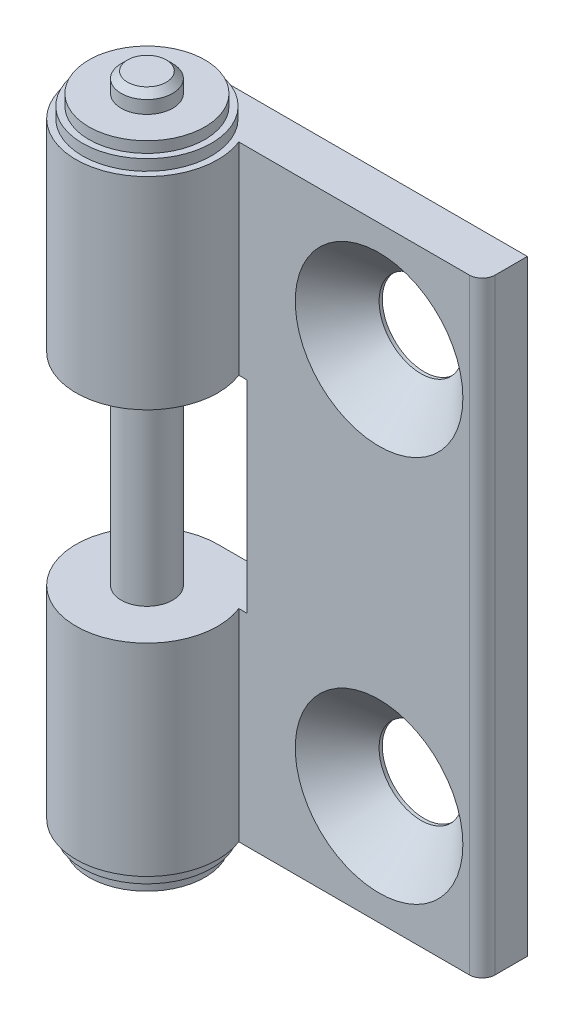
ISO-10303-21;
HEADER;
FILE_DESCRIPTION(('STEP AP214'),'2;1');
FILE_NAME('part.step','',(''),(''),'','','');
FILE_SCHEMA(('AUTOMOTIVE_DESIGN { 1 0 10303 214 1 1 1 1 }'));
ENDSEC;
DATA;
#1=APPLICATION_CONTEXT('core data for automotive mechanical design processes');
#2=APPLICATION_PROTOCOL_DEFINITION('international standard','automotive_design',2000,#1);
#3=PRODUCT_CONTEXT('',#1,'mechanical');
#4=PRODUCT('Part','Part','',(#3));
#5=PRODUCT_RELATED_PRODUCT_CATEGORY('part','',(#4));
#6=PRODUCT_DEFINITION_FORMATION('','',#4);
#7=PRODUCT_DEFINITION_CONTEXT('part definition',#1,'design');
#8=PRODUCT_DEFINITION('design','',#6,#7);
#9=PRODUCT_DEFINITION_SHAPE('','',#8);
#10=(LENGTH_UNIT() NAMED_UNIT(*) SI_UNIT(.MILLI.,.METRE.));
#11=(NAMED_UNIT(*) PLANE_ANGLE_UNIT() SI_UNIT($,.RADIAN.));
#12=(NAMED_UNIT(*) SI_UNIT($,.STERADIAN.) SOLID_ANGLE_UNIT());
#13=UNCERTAINTY_MEASURE_WITH_UNIT(LENGTH_MEASURE(1.E-05),#10,'distance_accuracy_value','');
#14=(GEOMETRIC_REPRESENTATION_CONTEXT(3) GLOBAL_UNCERTAINTY_ASSIGNED_CONTEXT((#13)) GLOBAL_UNIT_ASSIGNED_CONTEXT((#10,
#11,#12)) REPRESENTATION_CONTEXT('',''));
#15=CARTESIAN_POINT('',(0.,0.,0.));
#16=DIRECTION('',(0.,0.,1.));
#17=DIRECTION('',(1.,0.,0.));
#18=AXIS2_PLACEMENT_3D('',#15,#16,#17);
#19=CARTESIAN_POINT('',(1.5,-26.7,0.));
#20=DIRECTION('',(0.,1.,0.));
#21=DIRECTION('',(0.,0.,1.));
#22=AXIS2_PLACEMENT_3D('',#19,#20,#21);
#23=PLANE('',#22);
#24=CARTESIAN_POINT('',(0.,-26.6999999999484,0.));
#25=DIRECTION('',(0.,1.,0.));
#26=DIRECTION('',(0.,0.,1.));
#27=AXIS2_PLACEMENT_3D('',#24,#25,#26);
#28=CIRCLE('',#27,1.50000000007822);
#29=CARTESIAN_POINT('',(0.,-26.6999999999484,1.50000000007822));
#30=VERTEX_POINT('',#29);
#31=EDGE_CURVE('P0_E17',#30,#30,#28,.T.);
#32=ORIENTED_EDGE('',*,*,#31,.F.);
#33=EDGE_LOOP('',(#32));
#34=FACE_BOUND('',#33,.T.);
#35=ADVANCED_FACE('P0_F14',(#34),#23,.F.);
#36=CARTESIAN_POINT('',(0.,26.7,0.));
#37=DIRECTION('',(0.,-1.,0.));
#38=DIRECTION('',(0.,0.,-1.));
#39=AXIS2_PLACEMENT_3D('',#36,#37,#38);
#40=PLANE('',#39);
#41=CARTESIAN_POINT('',(0.,26.7000000000621,0.));
#42=DIRECTION('',(0.,-1.,0.));
#43=DIRECTION('',(0.,0.,-1.));
#44=AXIS2_PLACEMENT_3D('',#41,#42,#43);
#45=CIRCLE('',#44,1.50000000002137);
#46=CARTESIAN_POINT('',(0.,26.7000000000621,-1.50000000002137));
#47=VERTEX_POINT('',#46);
#48=EDGE_CURVE('P0_E26',#47,#47,#45,.T.);
#49=ORIENTED_EDGE('',*,*,#48,.F.);
#50=EDGE_LOOP('',(#49));
#51=FACE_BOUND('',#50,.T.);
#52=ADVANCED_FACE('P0_F41',(#51),#40,.F.);
#53=CARTESIAN_POINT('',(0.,-26.2000000001308,0.));
#54=DIRECTION('',(0.,1.,0.));
#55=DIRECTION('',(0.,0.,1.));
#56=AXIS2_PLACEMENT_3D('',#53,#54,#55);
#57=CONICAL_SURFACE('',#56,1.99999999989586,0.785398163397448);
#58=CARTESIAN_POINT('',(0.,-26.2,0.));
#59=DIRECTION('',(0.,1.,0.));
#60=DIRECTION('',(0.,0.,1.));
#61=AXIS2_PLACEMENT_3D('',#58,#59,#60);
#62=CIRCLE('',#61,2.);
#63=CARTESIAN_POINT('',(0.,-26.2,2.));
#64=VERTEX_POINT('',#63);
#65=EDGE_CURVE('P0_E21',#64,#64,#62,.T.);
#66=ORIENTED_EDGE('',*,*,#65,.F.);
#67=EDGE_LOOP('',(#66));
#68=FACE_BOUND('',#67,.T.);
#69=ORIENTED_EDGE('',*,*,#31,.T.);
#70=EDGE_LOOP('',(#69));
#71=FACE_BOUND('',#70,.T.);
#72=ADVANCED_FACE('P0_F38',(#68,#71),#57,.T.);
#73=CARTESIAN_POINT('',(0.,26.2000000001308,0.));
#74=DIRECTION('',(0.,-1.,0.));
#75=DIRECTION('',(0.,0.,-1.));
#76=AXIS2_PLACEMENT_3D('',#73,#74,#75);
#77=CONICAL_SURFACE('',#76,1.99999999995271,0.785398163397448);
#78=ORIENTED_EDGE('',*,*,#48,.T.);
#79=EDGE_LOOP('',(#78));
#80=FACE_BOUND('',#79,.T.);
#81=CARTESIAN_POINT('',(0.,26.2,0.));
#82=DIRECTION('',(0.,1.,0.));
#83=DIRECTION('',(0.,0.,1.));
#84=AXIS2_PLACEMENT_3D('',#81,#82,#83);
#85=CIRCLE('',#84,2.);
#86=CARTESIAN_POINT('',(0.,26.2,2.));
#87=VERTEX_POINT('',#86);
#88=EDGE_CURVE('P0_E10',#87,#87,#85,.F.);
#89=ORIENTED_EDGE('',*,*,#88,.F.);
#90=EDGE_LOOP('',(#89));
#91=FACE_BOUND('',#90,.T.);
#92=ADVANCED_FACE('P0_F49',(#80,#91),#77,.T.);
#93=CARTESIAN_POINT('',(0.,-26.7,0.));
#94=DIRECTION('',(0.,1.,0.));
#95=DIRECTION('',(0.,0.,1.));
#96=AXIS2_PLACEMENT_3D('',#93,#94,#95);
#97=CYLINDRICAL_SURFACE('',#96,2.);
#98=ORIENTED_EDGE('',*,*,#88,.T.);
#99=EDGE_LOOP('',(#98));
#100=FACE_BOUND('',#99,.T.);
#101=ORIENTED_EDGE('',*,*,#65,.T.);
#102=EDGE_LOOP('',(#101));
#103=FACE_BOUND('',#102,.T.);
#104=ADVANCED_FACE('P0_F47',(#100,#103),#97,.T.);
#105=CLOSED_SHELL('',(#35,#52,#72,#92,#104));
#106=MANIFOLD_SOLID_BREP('P0_B1',#105);
#107=CARTESIAN_POINT('',(0.,23.5,0.));
#108=DIRECTION('',(0.,1.,0.));
#109=DIRECTION('',(0.,0.,1.));
#110=AXIS2_PLACEMENT_3D('',#107,#108,#109);
#111=CYLINDRICAL_SURFACE('',#110,4.5);
#112=CARTESIAN_POINT('',(0.,25.2,0.));
#113=DIRECTION('',(0.,1.,0.));
#114=DIRECTION('',(0.,0.,1.));
#115=AXIS2_PLACEMENT_3D('',#112,#113,#114);
#116=CIRCLE('',#115,4.5);
#117=CARTESIAN_POINT('',(0.,25.2,4.5));
#118=VERTEX_POINT('',#117);
#119=EDGE_CURVE('P1_E192',#118,#118,#116,.F.);
#120=ORIENTED_EDGE('',*,*,#119,.T.);
#121=EDGE_LOOP('',(#120));
#122=FACE_BOUND('',#121,.T.);
#123=CARTESIAN_POINT('',(0.,24.35,0.));
#124=DIRECTION('',(0.,1.,0.));
#125=DIRECTION('',(0.,0.,1.));
#126=AXIS2_PLACEMENT_3D('',#123,#124,#125);
#127=CIRCLE('',#126,4.5);
#128=CARTESIAN_POINT('',(0.,24.35,4.5));
#129=VERTEX_POINT('',#128);
#130=EDGE_CURVE('P1_E194',#129,#129,#127,.T.);
#131=ORIENTED_EDGE('',*,*,#130,.T.);
#132=EDGE_LOOP('',(#131));
#133=FACE_BOUND('',#132,.T.);
#134=ADVANCED_FACE('P1_F16',(#122,#133),#111,.T.);
#135=CARTESIAN_POINT('',(0.,-25.2,0.));
#136=DIRECTION('',(0.,1.,0.));
#137=DIRECTION('',(0.,0.,1.));
#138=AXIS2_PLACEMENT_3D('',#135,#136,#137);
#139=CYLINDRICAL_SURFACE('',#138,4.5);
#140=CARTESIAN_POINT('',(0.,-24.35,0.));
#141=DIRECTION('',(0.,1.,0.));
#142=DIRECTION('',(0.,0.,1.));
#143=AXIS2_PLACEMENT_3D('',#140,#141,#142);
#144=CIRCLE('',#143,4.5);
#145=CARTESIAN_POINT('',(0.,-24.35,4.5));
#146=VERTEX_POINT('',#145);
#147=EDGE_CURVE('P1_E19',#146,#146,#144,.F.);
#148=ORIENTED_EDGE('',*,*,#147,.T.);
#149=EDGE_LOOP('',(#148));
#150=FACE_BOUND('',#149,.T.);
#151=CARTESIAN_POINT('',(0.,-25.2,0.));
#152=DIRECTION('',(0.,1.,0.));
#153=DIRECTION('',(0.,0.,1.));
#154=AXIS2_PLACEMENT_3D('',#151,#152,#153);
#155=CIRCLE('',#154,4.5);
#156=CARTESIAN_POINT('',(0.,-25.2,4.5));
#157=VERTEX_POINT('',#156);
#158=EDGE_CURVE('P1_E189',#157,#157,#155,.T.);
#159=ORIENTED_EDGE('',*,*,#158,.T.);
#160=EDGE_LOOP('',(#159));
#161=FACE_BOUND('',#160,.T.);
#162=ADVANCED_FACE('P1_F201',(#150,#161),#139,.T.);
#163=CARTESIAN_POINT('',(5.,-24.35,0.));
#164=DIRECTION('',(0.,1.,0.));
#165=DIRECTION('',(0.,0.,1.));
#166=AXIS2_PLACEMENT_3D('',#163,#164,#165);
#167=PLANE('',#166);
#168=CARTESIAN_POINT('',(0.,-24.35,0.));
#169=DIRECTION('',(0.,1.,0.));
#170=DIRECTION('',(0.,0.,1.));
#171=AXIS2_PLACEMENT_3D('',#168,#169,#170);
#172=CIRCLE('',#171,5.);
#173=CARTESIAN_POINT('',(0.,-24.35,5.));
#174=VERTEX_POINT('',#173);
#175=EDGE_CURVE('P1_E78',#174,#174,#172,.T.);
#176=ORIENTED_EDGE('',*,*,#175,.F.);
#177=EDGE_LOOP('',(#176));
#178=FACE_BOUND('',#177,.T.);
#179=ORIENTED_EDGE('',*,*,#147,.F.);
#180=EDGE_LOOP('',(#179));
#181=FACE_BOUND('',#180,.T.);
#182=ADVANCED_FACE('P1_F204',(#178,#181),#167,.F.);
#183=CARTESIAN_POINT('',(4.5,24.35,0.));
#184=DIRECTION('',(0.,-1.,0.));
#185=DIRECTION('',(0.,0.,-1.));
#186=AXIS2_PLACEMENT_3D('',#183,#184,#185);
#187=PLANE('',#186);
#188=ORIENTED_EDGE('',*,*,#130,.F.);
#189=EDGE_LOOP('',(#188));
#190=FACE_BOUND('',#189,.T.);
#191=CARTESIAN_POINT('',(0.,24.35,0.));
#192=DIRECTION('',(0.,1.,0.));
#193=DIRECTION('',(0.,0.,1.));
#194=AXIS2_PLACEMENT_3D('',#191,#192,#193);
#195=CIRCLE('',#194,5.);
#196=CARTESIAN_POINT('',(0.,24.35,5.));
#197=VERTEX_POINT('',#196);
#198=EDGE_CURVE('P1_E77',#197,#197,#195,.F.);
#199=ORIENTED_EDGE('',*,*,#198,.F.);
#200=EDGE_LOOP('',(#199));
#201=FACE_BOUND('',#200,.T.);
#202=ADVANCED_FACE('P1_F206',(#190,#201),#187,.F.);
#203=CARTESIAN_POINT('',(0.,25.2,0.));
#204=DIRECTION('',(0.,-1.,0.));
#205=DIRECTION('',(0.,0.,-1.));
#206=AXIS2_PLACEMENT_3D('',#203,#204,#205);
#207=PLANE('',#206);
#208=CARTESIAN_POINT('',(0.,25.2,0.));
#209=DIRECTION('',(0.,1.,0.));
#210=DIRECTION('',(0.,0.,1.));
#211=AXIS2_PLACEMENT_3D('',#208,#209,#210);
#212=CIRCLE('',#211,2.);
#213=CARTESIAN_POINT('',(0.,25.2,2.));
#214=VERTEX_POINT('',#213);
#215=EDGE_CURVE('P1_E182',#214,#214,#212,.F.);
#216=ORIENTED_EDGE('',*,*,#215,.T.);
#217=EDGE_LOOP('',(#216));
#218=FACE_BOUND('',#217,.T.);
#219=ORIENTED_EDGE('',*,*,#119,.F.);
#220=EDGE_LOOP('',(#219));
#221=FACE_BOUND('',#220,.T.);
#222=ADVANCED_FACE('P1_F214',(#218,#221),#207,.F.);
#223=CARTESIAN_POINT('',(4.5,-25.2,0.));
#224=DIRECTION('',(0.,1.,0.));
#225=DIRECTION('',(0.,0.,1.));
#226=AXIS2_PLACEMENT_3D('',#223,#224,#225);
#227=PLANE('',#226);
#228=ORIENTED_EDGE('',*,*,#158,.F.);
#229=EDGE_LOOP('',(#228));
#230=FACE_BOUND('',#229,.T.);
#231=CARTESIAN_POINT('',(0.,-25.2,0.));
#232=DIRECTION('',(0.,1.,0.));
#233=DIRECTION('',(0.,0.,1.));
#234=AXIS2_PLACEMENT_3D('',#231,#232,#233);
#235=CIRCLE('',#234,2.);
#236=CARTESIAN_POINT('',(0.,-25.2,2.));
#237=VERTEX_POINT('',#236);
#238=EDGE_CURVE('P1_E179',#237,#237,#235,.T.);
#239=ORIENTED_EDGE('',*,*,#238,.T.);
#240=EDGE_LOOP('',(#239));
#241=FACE_BOUND('',#240,.T.);
#242=ADVANCED_FACE('P1_F292',(#230,#241),#227,.F.);
#243=CARTESIAN_POINT('',(16.,15.,-1.99999999995271));
#244=DIRECTION('',(0.,0.,1.));
#245=DIRECTION('',(1.,0.,0.));
#246=AXIS2_PLACEMENT_3D('',#243,#244,#245);
#247=CONICAL_SURFACE('',#246,6.49999999997954,0.785398163388703);
#248=CARTESIAN_POINT('',(16.,15.,-5.25));
#249=DIRECTION('',(0.,0.,-1.));
#250=DIRECTION('',(-1.,0.,0.));
#251=AXIS2_PLACEMENT_3D('',#248,#249,#250);
#252=CIRCLE('',#251,3.25);
#253=CARTESIAN_POINT('',(12.75,15.,-5.25));
#254=VERTEX_POINT('',#253);
#255=EDGE_CURVE('P1_E90',#254,#254,#252,.T.);
#256=ORIENTED_EDGE('',*,*,#255,.T.);
#257=EDGE_LOOP('',(#256));
#258=FACE_BOUND('',#257,.T.);
#259=CARTESIAN_POINT('',(16.,15.,-1.99999999995271));
#260=DIRECTION('',(0.,0.,1.));
#261=DIRECTION('',(1.,0.,0.));
#262=AXIS2_PLACEMENT_3D('',#259,#260,#261);
#263=CIRCLE('',#262,6.49999999997954);
#264=CARTESIAN_POINT('',(22.4999999999795,15.,-1.99999999995271));
#265=VERTEX_POINT('',#264);
#266=EDGE_CURVE('P1_E176',#265,#265,#263,.F.);
#267=ORIENTED_EDGE('',*,*,#266,.F.);
#268=EDGE_LOOP('',(#267));
#269=FACE_BOUND('',#268,.T.);
#270=ADVANCED_FACE('P1_F288',(#258,#269),#247,.F.);
#271=CARTESIAN_POINT('',(16.,-15.,-2.00000000000955));
#272=DIRECTION('',(0.,0.,1.));
#273=DIRECTION('',(1.,0.,0.));
#274=AXIS2_PLACEMENT_3D('',#271,#272,#273);
#275=CONICAL_SURFACE('',#274,6.49999999997954,0.785398163397448);
#276=CARTESIAN_POINT('',(16.,-15.,-5.25));
#277=DIRECTION('',(0.,0.,-1.));
#278=DIRECTION('',(-1.,0.,0.));
#279=AXIS2_PLACEMENT_3D('',#276,#277,#278);
#280=CIRCLE('',#279,3.25);
#281=CARTESIAN_POINT('',(12.75,-15.,-5.25));
#282=VERTEX_POINT('',#281);
#283=EDGE_CURVE('P1_E129',#282,#282,#280,.T.);
#284=ORIENTED_EDGE('',*,*,#283,.T.);
#285=EDGE_LOOP('',(#284));
#286=FACE_BOUND('',#285,.T.);
#287=CARTESIAN_POINT('',(16.,-15.,-2.00000000000955));
#288=DIRECTION('',(0.,0.,1.));
#289=DIRECTION('',(1.,0.,0.));
#290=AXIS2_PLACEMENT_3D('',#287,#288,#289);
#291=CIRCLE('',#290,6.49999999997954);
#292=CARTESIAN_POINT('',(22.4999999999795,-15.,-2.00000000000955));
#293=VERTEX_POINT('',#292);
#294=EDGE_CURVE('P1_E91',#293,#293,#291,.F.);
#295=ORIENTED_EDGE('',*,*,#294,.F.);
#296=EDGE_LOOP('',(#295));
#297=FACE_BOUND('',#296,.T.);
#298=ADVANCED_FACE('P1_F284',(#286,#297),#275,.F.);
#299=CARTESIAN_POINT('',(0.,-25.2,0.));
#300=DIRECTION('',(0.,1.,0.));
#301=DIRECTION('',(0.,0.,1.));
#302=AXIS2_PLACEMENT_3D('',#299,#300,#301);
#303=CYLINDRICAL_SURFACE('',#302,5.);
#304=CARTESIAN_POINT('',(0.,-23.5,0.));
#305=DIRECTION('',(0.,1.,0.));
#306=DIRECTION('',(0.,0.,1.));
#307=AXIS2_PLACEMENT_3D('',#304,#305,#306);
#308=CIRCLE('',#307,5.);
#309=CARTESIAN_POINT('',(0.,-23.5,5.));
#310=VERTEX_POINT('',#309);
#311=EDGE_CURVE('P1_E128',#310,#310,#308,.F.);
#312=ORIENTED_EDGE('',*,*,#311,.T.);
#313=EDGE_LOOP('',(#312));
#314=FACE_BOUND('',#313,.T.);
#315=ORIENTED_EDGE('',*,*,#175,.T.);
#316=EDGE_LOOP('',(#315));
#317=FACE_BOUND('',#316,.T.);
#318=ADVANCED_FACE('P1_F281',(#314,#317),#303,.T.);
#319=CARTESIAN_POINT('',(23.,23.5,-3.));
#320=DIRECTION('',(0.,1.,0.));
#321=DIRECTION('',(0.,0.,1.));
#322=AXIS2_PLACEMENT_3D('',#319,#320,#321);
#323=CYLINDRICAL_SURFACE('',#322,1.);
#324=CARTESIAN_POINT('',(23.,23.5,-3.));
#325=DIRECTION('',(0.,1.,0.));
#326=DIRECTION('',(0.,0.,1.));
#327=AXIS2_PLACEMENT_3D('',#324,#325,#326);
#328=CIRCLE('',#327,1.);
#329=CARTESIAN_POINT('',(24.,23.5,-3.));
#330=VERTEX_POINT('',#329);
#331=CARTESIAN_POINT('',(23.,23.5,-2.));
#332=VERTEX_POINT('',#331);
#333=EDGE_CURVE('P1_E67',#330,#332,#328,.F.);
#334=ORIENTED_EDGE('',*,*,#333,.T.);
#335=DIRECTION('',(0.,1.,0.));
#336=VECTOR('',#335,1.);
#337=CARTESIAN_POINT('',(23.,0.,-2.));
#338=LINE('',#337,#336);
#339=CARTESIAN_POINT('',(23.,-23.5,-2.));
#340=VERTEX_POINT('',#339);
#341=EDGE_CURVE('P1_E72',#340,#332,#338,.T.);
#342=ORIENTED_EDGE('',*,*,#341,.F.);
#343=CARTESIAN_POINT('',(23.,-23.5,-3.));
#344=DIRECTION('',(0.,1.,0.));
#345=DIRECTION('',(0.,0.,1.));
#346=AXIS2_PLACEMENT_3D('',#343,#344,#345);
#347=CIRCLE('',#346,1.);
#348=CARTESIAN_POINT('',(24.,-23.5,-3.));
#349=VERTEX_POINT('',#348);
#350=EDGE_CURVE('P1_E119',#340,#349,#347,.T.);
#351=ORIENTED_EDGE('',*,*,#350,.T.);
#352=DIRECTION('',(0.,1.,0.));
#353=VECTOR('',#352,1.);
#354=CARTESIAN_POINT('',(24.,-23.5,-3.));
#355=LINE('',#354,#353);
#356=EDGE_CURVE('P1_E75',#349,#330,#355,.T.);
#357=ORIENTED_EDGE('',*,*,#356,.T.);
#358=EDGE_LOOP('',(#334,#342,#351,#357));
#359=FACE_BOUND('',#358,.T.);
#360=ADVANCED_FACE('P1_F71',(#359),#323,.T.);
#361=CARTESIAN_POINT('',(0.,23.5,0.));
#362=DIRECTION('',(0.,1.,0.));
#363=DIRECTION('',(0.,0.,1.));
#364=AXIS2_PLACEMENT_3D('',#361,#362,#363);
#365=CYLINDRICAL_SURFACE('',#364,5.);
#366=ORIENTED_EDGE('',*,*,#198,.T.);
#367=EDGE_LOOP('',(#366));
#368=FACE_BOUND('',#367,.T.);
#369=CARTESIAN_POINT('',(0.,23.5,0.));
#370=DIRECTION('',(0.,1.,0.));
#371=DIRECTION('',(0.,0.,1.));
#372=AXIS2_PLACEMENT_3D('',#369,#370,#371);
#373=CIRCLE('',#372,5.);
#374=CARTESIAN_POINT('',(0.,23.5,5.));
#375=VERTEX_POINT('',#374);
#376=EDGE_CURVE('P1_E97',#375,#375,#373,.T.);
#377=ORIENTED_EDGE('',*,*,#376,.T.);
#378=EDGE_LOOP('',(#377));
#379=FACE_BOUND('',#378,.T.);
#380=ADVANCED_FACE('P1_F274',(#368,#379),#365,.T.);
#381=CARTESIAN_POINT('',(0.,-26.7,0.));
#382=DIRECTION('',(0.,1.,0.));
#383=DIRECTION('',(0.,0.,1.));
#384=AXIS2_PLACEMENT_3D('',#381,#382,#383);
#385=CYLINDRICAL_SURFACE('',#384,2.);
#386=ORIENTED_EDGE('',*,*,#215,.F.);
#387=EDGE_LOOP('',(#386));
#388=FACE_BOUND('',#387,.T.);
#389=CARTESIAN_POINT('',(0.,7.83333333333333,0.));
#390=DIRECTION('',(0.,1.,0.));
#391=DIRECTION('',(0.,0.,1.));
#392=AXIS2_PLACEMENT_3D('',#389,#390,#391);
#393=CIRCLE('',#392,2.);
#394=CARTESIAN_POINT('',(0.,7.83333333333333,2.));
#395=VERTEX_POINT('',#394);
#396=EDGE_CURVE('P1_E150',#395,#395,#393,.F.);
#397=ORIENTED_EDGE('',*,*,#396,.T.);
#398=EDGE_LOOP('',(#397));
#399=FACE_BOUND('',#398,.T.);
#400=ADVANCED_FACE('P1_F270',(#388,#399),#385,.F.);
#401=CARTESIAN_POINT('',(0.,-26.7,0.));
#402=DIRECTION('',(0.,1.,0.));
#403=DIRECTION('',(0.,0.,1.));
#404=AXIS2_PLACEMENT_3D('',#401,#402,#403);
#405=CYLINDRICAL_SURFACE('',#404,2.);
#406=CARTESIAN_POINT('',(0.,-7.83333333333333,0.));
#407=DIRECTION('',(0.,1.,0.));
#408=DIRECTION('',(0.,0.,1.));
#409=AXIS2_PLACEMENT_3D('',#406,#407,#408);
#410=CIRCLE('',#409,2.);
#411=CARTESIAN_POINT('',(0.,-7.83333333333333,2.));
#412=VERTEX_POINT('',#411);
#413=EDGE_CURVE('P1_E145',#412,#412,#410,.T.);
#414=ORIENTED_EDGE('',*,*,#413,.T.);
#415=EDGE_LOOP('',(#414));
#416=FACE_BOUND('',#415,.T.);
#417=ORIENTED_EDGE('',*,*,#238,.F.);
#418=EDGE_LOOP('',(#417));
#419=FACE_BOUND('',#418,.T.);
#420=ADVANCED_FACE('P1_F267',(#416,#419),#405,.F.);
#421=CARTESIAN_POINT('',(0.,0.,-2.));
#422=DIRECTION('',(0.,0.,1.));
#423=DIRECTION('',(1.,0.,0.));
#424=AXIS2_PLACEMENT_3D('',#421,#422,#423);
#425=PLANE('',#424);
#426=DIRECTION('',(1.,0.,0.));
#427=VECTOR('',#426,1.);
#428=CARTESIAN_POINT('',(5.75,-7.83333333333333,-2.));
#429=LINE('',#428,#427);
#430=CARTESIAN_POINT('',(5.75,-7.83333333333333,-2.));
#431=VERTEX_POINT('',#430);
#432=CARTESIAN_POINT('',(5.1234753829798,-7.83333333333333,-2.));
#433=VERTEX_POINT('',#432);
#434=EDGE_CURVE('P1_E160',#431,#433,#429,.F.);
#435=ORIENTED_EDGE('',*,*,#434,.T.);
#436=DIRECTION('',(0.,1.,0.));
#437=VECTOR('',#436,1.);
#438=CARTESIAN_POINT('',(5.1234753829798,-23.5,-2.));
#439=LINE('',#438,#437);
#440=CARTESIAN_POINT('',(5.1234753829798,-23.5,-2.));
#441=VERTEX_POINT('',#440);
#442=EDGE_CURVE('P1_E138',#441,#433,#439,.T.);
#443=ORIENTED_EDGE('',*,*,#442,.F.);
#444=DIRECTION('',(1.,0.,0.));
#445=VECTOR('',#444,1.);
#446=CARTESIAN_POINT('',(5.5,-23.5,-2.));
#447=LINE('',#446,#445);
#448=EDGE_CURVE('P1_E89',#441,#340,#447,.T.);
#449=ORIENTED_EDGE('',*,*,#448,.T.);
#450=ORIENTED_EDGE('',*,*,#341,.T.);
#451=DIRECTION('',(1.,0.,0.));
#452=VECTOR('',#451,1.);
#453=CARTESIAN_POINT('',(0.,23.5,-2.));
#454=LINE('',#453,#452);
#455=CARTESIAN_POINT('',(5.1234753829798,23.5,-2.));
#456=VERTEX_POINT('',#455);
#457=EDGE_CURVE('P1_E85',#332,#456,#454,.F.);
#458=ORIENTED_EDGE('',*,*,#457,.T.);
#459=DIRECTION('',(0.,1.,0.));
#460=VECTOR('',#459,1.);
#461=CARTESIAN_POINT('',(5.1234753829798,-23.5,-2.));
#462=LINE('',#461,#460);
#463=CARTESIAN_POINT('',(5.1234753829798,7.83333333333333,-2.));
#464=VERTEX_POINT('',#463);
#465=EDGE_CURVE('P1_E149',#464,#456,#462,.T.);
#466=ORIENTED_EDGE('',*,*,#465,.F.);
#467=DIRECTION('',(-1.,0.,0.));
#468=VECTOR('',#467,1.);
#469=CARTESIAN_POINT('',(-5.5,7.83333333333333,-2.));
#470=LINE('',#469,#468);
#471=CARTESIAN_POINT('',(5.75,7.83333333333333,-2.));
#472=VERTEX_POINT('',#471);
#473=EDGE_CURVE('P1_E167',#464,#472,#470,.F.);
#474=ORIENTED_EDGE('',*,*,#473,.T.);
#475=DIRECTION('',(0.,1.,0.));
#476=VECTOR('',#475,1.);
#477=CARTESIAN_POINT('',(5.75,7.83333333333333,-2.));
#478=LINE('',#477,#476);
#479=EDGE_CURVE('P1_E142',#472,#431,#478,.F.);
#480=ORIENTED_EDGE('',*,*,#479,.T.);
#481=EDGE_LOOP('',(#435,#443,#449,#450,#458,#466,#474,#480));
#482=FACE_BOUND('',#481,.T.);
#483=ORIENTED_EDGE('',*,*,#294,.T.);
#484=EDGE_LOOP('',(#483));
#485=FACE_BOUND('',#484,.T.);
#486=ORIENTED_EDGE('',*,*,#266,.T.);
#487=EDGE_LOOP('',(#486));
#488=FACE_BOUND('',#487,.T.);
#489=ADVANCED_FACE('P1_F83',(#482,#485,#488),#425,.T.);
#490=CARTESIAN_POINT('',(16.,15.,-2.));
#491=DIRECTION('',(0.,0.,-1.));
#492=DIRECTION('',(-1.,0.,0.));
#493=AXIS2_PLACEMENT_3D('',#490,#491,#492);
#494=CYLINDRICAL_SURFACE('',#493,3.25);
#495=CARTESIAN_POINT('',(16.,15.,-5.5));
#496=DIRECTION('',(0.,0.,-1.));
#497=DIRECTION('',(-1.,0.,0.));
#498=AXIS2_PLACEMENT_3D('',#495,#496,#497);
#499=CIRCLE('',#498,3.25);
#500=CARTESIAN_POINT('',(12.75,15.,-5.5));
#501=VERTEX_POINT('',#500);
#502=EDGE_CURVE('P1_E140',#501,#501,#499,.T.);
#503=ORIENTED_EDGE('',*,*,#502,.T.);
#504=EDGE_LOOP('',(#503));
#505=FACE_BOUND('',#504,.T.);
#506=ORIENTED_EDGE('',*,*,#255,.F.);
#507=EDGE_LOOP('',(#506));
#508=FACE_BOUND('',#507,.T.);
#509=ADVANCED_FACE('P1_F260',(#505,#508),#494,.F.);
#510=CARTESIAN_POINT('',(16.,-15.,-2.));
#511=DIRECTION('',(0.,0.,-1.));
#512=DIRECTION('',(-1.,0.,0.));
#513=AXIS2_PLACEMENT_3D('',#510,#511,#512);
#514=CYLINDRICAL_SURFACE('',#513,3.25);
#515=CARTESIAN_POINT('',(16.,-15.,-5.5));
#516=DIRECTION('',(0.,0.,-1.));
#517=DIRECTION('',(-1.,0.,0.));
#518=AXIS2_PLACEMENT_3D('',#515,#516,#517);
#519=CIRCLE('',#518,3.25);
#520=CARTESIAN_POINT('',(12.75,-15.,-5.5));
#521=VERTEX_POINT('',#520);
#522=EDGE_CURVE('P1_E124',#521,#521,#519,.T.);
#523=ORIENTED_EDGE('',*,*,#522,.T.);
#524=EDGE_LOOP('',(#523));
#525=FACE_BOUND('',#524,.T.);
#526=ORIENTED_EDGE('',*,*,#283,.F.);
#527=EDGE_LOOP('',(#526));
#528=FACE_BOUND('',#527,.T.);
#529=ADVANCED_FACE('P1_F256',(#525,#528),#514,.F.);
#530=CARTESIAN_POINT('',(5.5,-23.5,0.));
#531=DIRECTION('',(0.,1.,0.));
#532=DIRECTION('',(0.,0.,1.));
#533=AXIS2_PLACEMENT_3D('',#530,#531,#532);
#534=PLANE('',#533);
#535=ORIENTED_EDGE('',*,*,#350,.F.);
#536=ORIENTED_EDGE('',*,*,#448,.F.);
#537=CARTESIAN_POINT('',(0.,-23.5,0.));
#538=DIRECTION('',(0.,1.,0.));
#539=DIRECTION('',(0.,0.,1.));
#540=AXIS2_PLACEMENT_3D('',#537,#538,#539);
#541=CIRCLE('',#540,5.5);
#542=CARTESIAN_POINT('',(0.,-23.5,-5.5));
#543=VERTEX_POINT('',#542);
#544=EDGE_CURVE('P1_E141',#543,#441,#541,.T.);
#545=ORIENTED_EDGE('',*,*,#544,.F.);
#546=DIRECTION('',(1.,0.,0.));
#547=VECTOR('',#546,1.);
#548=CARTESIAN_POINT('',(0.,-23.5,-5.5));
#549=LINE('',#548,#547);
#550=CARTESIAN_POINT('',(24.,-23.5,-5.5));
#551=VERTEX_POINT('',#550);
#552=EDGE_CURVE('P1_E113',#543,#551,#549,.T.);
#553=ORIENTED_EDGE('',*,*,#552,.T.);
#554=DIRECTION('',(0.,0.,1.));
#555=VECTOR('',#554,1.);
#556=CARTESIAN_POINT('',(24.,-23.5,-2.));
#557=LINE('',#556,#555);
#558=EDGE_CURVE('P1_E116',#551,#349,#557,.T.);
#559=ORIENTED_EDGE('',*,*,#558,.T.);
#560=EDGE_LOOP('',(#535,#536,#545,#553,#559));
#561=FACE_BOUND('',#560,.T.);
#562=ORIENTED_EDGE('',*,*,#311,.F.);
#563=EDGE_LOOP('',(#562));
#564=FACE_BOUND('',#563,.T.);
#565=ADVANCED_FACE('P1_F252',(#561,#564),#534,.F.);
#566=CARTESIAN_POINT('',(24.,-23.5,-2.));
#567=DIRECTION('',(-1.,0.,0.));
#568=DIRECTION('',(0.,0.,1.));
#569=AXIS2_PLACEMENT_3D('',#566,#567,#568);
#570=PLANE('',#569);
#571=ORIENTED_EDGE('',*,*,#558,.F.);
#572=DIRECTION('',(0.,1.,0.));
#573=VECTOR('',#572,1.);
#574=CARTESIAN_POINT('',(24.,0.,-5.5));
#575=LINE('',#574,#573);
#576=CARTESIAN_POINT('',(24.,23.5,-5.5));
#577=VERTEX_POINT('',#576);
#578=EDGE_CURVE('P1_E109',#551,#577,#575,.T.);
#579=ORIENTED_EDGE('',*,*,#578,.T.);
#580=DIRECTION('',(0.,0.,-1.));
#581=VECTOR('',#580,1.);
#582=CARTESIAN_POINT('',(24.,23.5,0.));
#583=LINE('',#582,#581);
#584=EDGE_CURVE('P1_E98',#577,#330,#583,.F.);
#585=ORIENTED_EDGE('',*,*,#584,.T.);
#586=ORIENTED_EDGE('',*,*,#356,.F.);
#587=EDGE_LOOP('',(#571,#579,#585,#586));
#588=FACE_BOUND('',#587,.T.);
#589=ADVANCED_FACE('P1_F248',(#588),#570,.F.);
#590=CARTESIAN_POINT('',(0.,23.5,0.));
#591=DIRECTION('',(0.,-1.,0.));
#592=DIRECTION('',(0.,0.,-1.));
#593=AXIS2_PLACEMENT_3D('',#590,#591,#592);
#594=PLANE('',#593);
#595=ORIENTED_EDGE('',*,*,#376,.F.);
#596=EDGE_LOOP('',(#595));
#597=FACE_BOUND('',#596,.T.);
#598=ORIENTED_EDGE('',*,*,#457,.F.);
#599=ORIENTED_EDGE('',*,*,#333,.F.);
#600=ORIENTED_EDGE('',*,*,#584,.F.);
#601=DIRECTION('',(1.,0.,0.));
#602=VECTOR('',#601,1.);
#603=CARTESIAN_POINT('',(0.,23.5,-5.5));
#604=LINE('',#603,#602);
#605=CARTESIAN_POINT('',(0.,23.5,-5.5));
#606=VERTEX_POINT('',#605);
#607=EDGE_CURVE('P1_E112',#577,#606,#604,.F.);
#608=ORIENTED_EDGE('',*,*,#607,.T.);
#609=CARTESIAN_POINT('',(0.,23.5,0.));
#610=DIRECTION('',(0.,1.,0.));
#611=DIRECTION('',(0.,0.,1.));
#612=AXIS2_PLACEMENT_3D('',#609,#610,#611);
#613=CIRCLE('',#612,5.5);
#614=EDGE_CURVE('P1_E96',#456,#606,#613,.F.);
#615=ORIENTED_EDGE('',*,*,#614,.F.);
#616=EDGE_LOOP('',(#598,#599,#600,#608,#615));
#617=FACE_BOUND('',#616,.T.);
#618=ADVANCED_FACE('P1_F94',(#597,#617),#594,.F.);
#619=CARTESIAN_POINT('',(0.,-23.5,0.));
#620=DIRECTION('',(0.,1.,0.));
#621=DIRECTION('',(0.,0.,1.));
#622=AXIS2_PLACEMENT_3D('',#619,#620,#621);
#623=CYLINDRICAL_SURFACE('',#622,5.5);
#624=CARTESIAN_POINT('',(0.,7.83333333333333,0.));
#625=DIRECTION('',(0.,1.,0.));
#626=DIRECTION('',(0.,0.,1.));
#627=AXIS2_PLACEMENT_3D('',#624,#625,#626);
#628=CIRCLE('',#627,5.5);
#629=CARTESIAN_POINT('',(0.,7.83333333333333,-5.5));
#630=VERTEX_POINT('',#629);
#631=EDGE_CURVE('P1_E164',#630,#464,#628,.T.);
#632=ORIENTED_EDGE('',*,*,#631,.T.);
#633=ORIENTED_EDGE('',*,*,#465,.T.);
#634=ORIENTED_EDGE('',*,*,#614,.T.);
#635=DIRECTION('',(0.,1.,0.));
#636=VECTOR('',#635,1.);
#637=CARTESIAN_POINT('',(0.,0.,-5.5));
#638=LINE('',#637,#636);
#639=EDGE_CURVE('P1_E774',#606,#630,#638,.F.);
#640=ORIENTED_EDGE('',*,*,#639,.T.);
#641=EDGE_LOOP('',(#632,#633,#634,#640));
#642=FACE_BOUND('',#641,.T.);
#643=ADVANCED_FACE('P1_F241',(#642),#623,.T.);
#644=CARTESIAN_POINT('',(-5.5,7.83333333333333,47.));
#645=DIRECTION('',(0.,1.,0.));
#646=DIRECTION('',(-1.,0.,0.));
#647=AXIS2_PLACEMENT_3D('',#644,#645,#646);
#648=PLANE('',#647);
#649=ORIENTED_EDGE('',*,*,#631,.F.);
#650=DIRECTION('',(1.,0.,0.));
#651=VECTOR('',#650,1.);
#652=CARTESIAN_POINT('',(0.,7.83333333333333,-5.5));
#653=LINE('',#652,#651);
#654=CARTESIAN_POINT('',(5.75,7.83333333333333,-5.5));
#655=VERTEX_POINT('',#654);
#656=EDGE_CURVE('P1_E775',#630,#655,#653,.T.);
#657=ORIENTED_EDGE('',*,*,#656,.T.);
#658=DIRECTION('',(0.,0.,-1.));
#659=VECTOR('',#658,1.);
#660=CARTESIAN_POINT('',(5.75,7.83333333333333,47.));
#661=LINE('',#660,#659);
#662=EDGE_CURVE('P1_E146',#655,#472,#661,.F.);
#663=ORIENTED_EDGE('',*,*,#662,.T.);
#664=ORIENTED_EDGE('',*,*,#473,.F.);
#665=EDGE_LOOP('',(#649,#657,#663,#664));
#666=FACE_BOUND('',#665,.T.);
#667=ORIENTED_EDGE('',*,*,#396,.F.);
#668=EDGE_LOOP('',(#667));
#669=FACE_BOUND('',#668,.T.);
#670=ADVANCED_FACE('P1_F237',(#666,#669),#648,.F.);
#671=CARTESIAN_POINT('',(5.75,7.83333333333333,47.));
#672=DIRECTION('',(1.,0.,0.));
#673=DIRECTION('',(0.,0.,-1.));
#674=AXIS2_PLACEMENT_3D('',#671,#672,#673);
#675=PLANE('',#674);
#676=ORIENTED_EDGE('',*,*,#662,.F.);
#677=DIRECTION('',(0.,1.,0.));
#678=VECTOR('',#677,1.);
#679=CARTESIAN_POINT('',(5.75,0.,-5.5));
#680=LINE('',#679,#678);
#681=CARTESIAN_POINT('',(5.75,-7.83333333333333,-5.5));
#682=VERTEX_POINT('',#681);
#683=EDGE_CURVE('P1_E786',#655,#682,#680,.F.);
#684=ORIENTED_EDGE('',*,*,#683,.T.);
#685=DIRECTION('',(0.,0.,1.));
#686=VECTOR('',#685,1.);
#687=CARTESIAN_POINT('',(5.75,-7.83333333333333,47.));
#688=LINE('',#687,#686);
#689=EDGE_CURVE('P1_E163',#682,#431,#688,.T.);
#690=ORIENTED_EDGE('',*,*,#689,.T.);
#691=ORIENTED_EDGE('',*,*,#479,.F.);
#692=EDGE_LOOP('',(#676,#684,#690,#691));
#693=FACE_BOUND('',#692,.T.);
#694=ADVANCED_FACE('P1_F233',(#693),#675,.F.);
#695=CARTESIAN_POINT('',(5.75,-7.83333333333333,47.));
#696=DIRECTION('',(0.,-1.,0.));
#697=DIRECTION('',(1.,0.,0.));
#698=AXIS2_PLACEMENT_3D('',#695,#696,#697);
#699=PLANE('',#698);
#700=ORIENTED_EDGE('',*,*,#689,.F.);
#701=DIRECTION('',(1.,0.,0.));
#702=VECTOR('',#701,1.);
#703=CARTESIAN_POINT('',(0.,-7.83333333333333,-5.5));
#704=LINE('',#703,#702);
#705=CARTESIAN_POINT('',(0.,-7.83333333333333,-5.5));
#706=VERTEX_POINT('',#705);
#707=EDGE_CURVE('P1_E25',#682,#706,#704,.F.);
#708=ORIENTED_EDGE('',*,*,#707,.T.);
#709=CARTESIAN_POINT('',(0.,-7.83333333333333,0.));
#710=DIRECTION('',(0.,1.,0.));
#711=DIRECTION('',(0.,0.,1.));
#712=AXIS2_PLACEMENT_3D('',#709,#710,#711);
#713=CIRCLE('',#712,5.5);
#714=EDGE_CURVE('P1_E33',#433,#706,#713,.F.);
#715=ORIENTED_EDGE('',*,*,#714,.F.);
#716=ORIENTED_EDGE('',*,*,#434,.F.);
#717=EDGE_LOOP('',(#700,#708,#715,#716));
#718=FACE_BOUND('',#717,.T.);
#719=ORIENTED_EDGE('',*,*,#413,.F.);
#720=EDGE_LOOP('',(#719));
#721=FACE_BOUND('',#720,.T.);
#722=ADVANCED_FACE('P1_F226',(#718,#721),#699,.F.);
#723=CARTESIAN_POINT('',(0.,-23.5,0.));
#724=DIRECTION('',(0.,1.,0.));
#725=DIRECTION('',(0.,0.,1.));
#726=AXIS2_PLACEMENT_3D('',#723,#724,#725);
#727=CYLINDRICAL_SURFACE('',#726,5.5);
#728=ORIENTED_EDGE('',*,*,#544,.T.);
#729=ORIENTED_EDGE('',*,*,#442,.T.);
#730=ORIENTED_EDGE('',*,*,#714,.T.);
#731=DIRECTION('',(0.,1.,0.));
#732=VECTOR('',#731,1.);
#733=CARTESIAN_POINT('',(0.,0.,-5.5));
#734=LINE('',#733,#732);
#735=EDGE_CURVE('P1_E11',#706,#543,#734,.F.);
#736=ORIENTED_EDGE('',*,*,#735,.T.);
#737=EDGE_LOOP('',(#728,#729,#730,#736));
#738=FACE_BOUND('',#737,.T.);
#739=ADVANCED_FACE('P1_F220',(#738),#727,.T.);
#740=CARTESIAN_POINT('',(0.,0.,-5.5));
#741=DIRECTION('',(0.,0.,1.));
#742=DIRECTION('',(1.,0.,0.));
#743=AXIS2_PLACEMENT_3D('',#740,#741,#742);
#744=PLANE('',#743);
#745=ORIENTED_EDGE('',*,*,#707,.F.);
#746=ORIENTED_EDGE('',*,*,#683,.F.);
#747=ORIENTED_EDGE('',*,*,#656,.F.);
#748=ORIENTED_EDGE('',*,*,#639,.F.);
#749=ORIENTED_EDGE('',*,*,#607,.F.);
#750=ORIENTED_EDGE('',*,*,#578,.F.);
#751=ORIENTED_EDGE('',*,*,#552,.F.);
#752=ORIENTED_EDGE('',*,*,#735,.F.);
#753=EDGE_LOOP('',(#745,#746,#747,#748,#749,#750,#751,#752));
#754=FACE_BOUND('',#753,.T.);
#755=ORIENTED_EDGE('',*,*,#522,.F.);
#756=EDGE_LOOP('',(#755));
#757=FACE_BOUND('',#756,.T.);
#758=ORIENTED_EDGE('',*,*,#502,.F.);
#759=EDGE_LOOP('',(#758));
#760=FACE_BOUND('',#759,.T.);
#761=ADVANCED_FACE('P1_F218',(#754,#757,#760),#744,.F.);
#762=CLOSED_SHELL('',(#134,#162,#182,#202,#222,#242,#270,#298,#318,#360,#380,#400,#420,#489,
#509,#529,#565,#589,#618,#643,#670,#694,#722,#739,#761));
#763=MANIFOLD_SOLID_BREP('P1_B1',#762);
#764=ADVANCED_BREP_SHAPE_REPRESENTATION('',(#18,#106,#763),#14);
#765=SHAPE_DEFINITION_REPRESENTATION(#9,#764);
ENDSEC;
END-ISO-10303-21;
